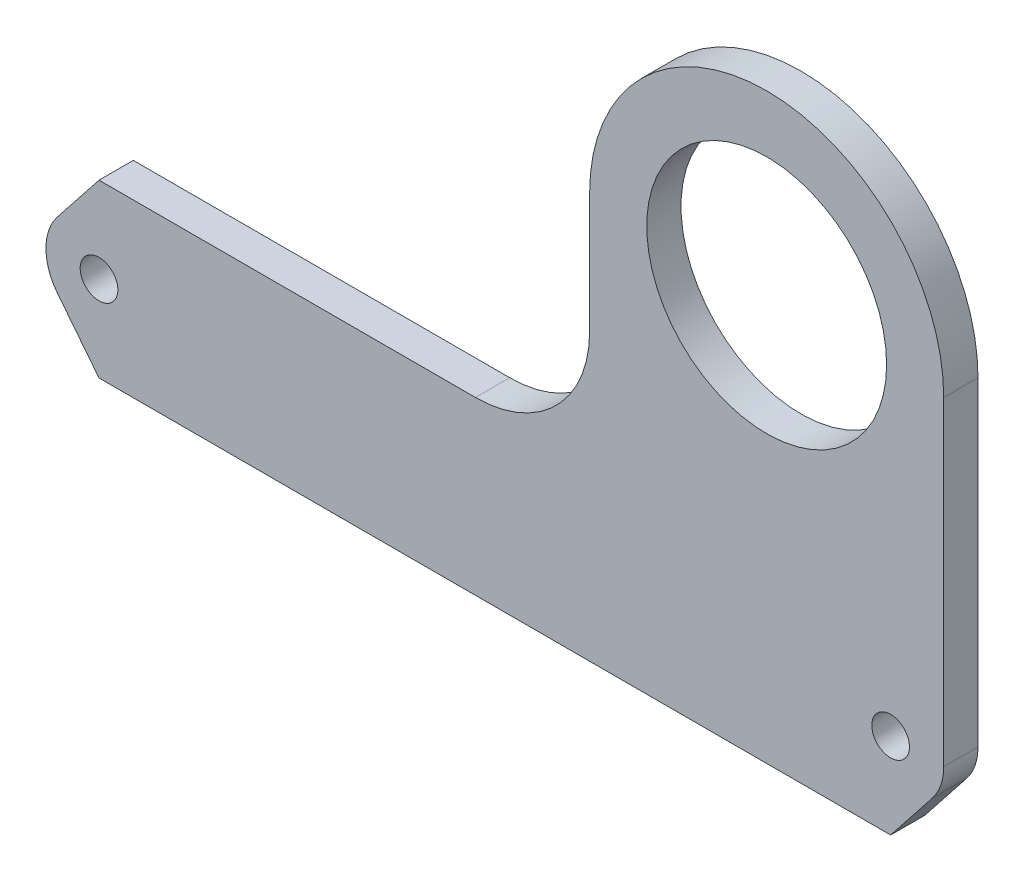
ISO-10303-21;
HEADER;
FILE_DESCRIPTION(('STEP AP214'),'2;1');
FILE_NAME('part.step','',(''),(''),'','','');
FILE_SCHEMA(('AUTOMOTIVE_DESIGN { 1 0 10303 214 1 1 1 1 }'));
ENDSEC;
DATA;
#1=APPLICATION_CONTEXT('core data for automotive mechanical design processes');
#2=APPLICATION_PROTOCOL_DEFINITION('international standard','automotive_design',2000,#1);
#3=PRODUCT_CONTEXT('',#1,'mechanical');
#4=PRODUCT('Part','Part','',(#3));
#5=PRODUCT_RELATED_PRODUCT_CATEGORY('part','',(#4));
#6=PRODUCT_DEFINITION_FORMATION('','',#4);
#7=PRODUCT_DEFINITION_CONTEXT('part definition',#1,'design');
#8=PRODUCT_DEFINITION('design','',#6,#7);
#9=PRODUCT_DEFINITION_SHAPE('','',#8);
#10=(LENGTH_UNIT() NAMED_UNIT(*) SI_UNIT(.MILLI.,.METRE.));
#11=(NAMED_UNIT(*) PLANE_ANGLE_UNIT() SI_UNIT($,.RADIAN.));
#12=(NAMED_UNIT(*) SI_UNIT($,.STERADIAN.) SOLID_ANGLE_UNIT());
#13=UNCERTAINTY_MEASURE_WITH_UNIT(LENGTH_MEASURE(1.E-05),#10,'distance_accuracy_value','');
#14=(GEOMETRIC_REPRESENTATION_CONTEXT(3) GLOBAL_UNCERTAINTY_ASSIGNED_CONTEXT((#13)) GLOBAL_UNIT_ASSIGNED_CONTEXT((#10,
#11,#12)) REPRESENTATION_CONTEXT('',''));
#15=CARTESIAN_POINT('',(0.,0.,0.));
#16=DIRECTION('',(0.,0.,1.));
#17=DIRECTION('',(1.,0.,0.));
#18=AXIS2_PLACEMENT_3D('',#15,#16,#17);
#19=CARTESIAN_POINT('',(0.,0.,3.));
#20=DIRECTION('',(0.,0.,1.));
#21=DIRECTION('',(1.,0.,0.));
#22=AXIS2_PLACEMENT_3D('',#19,#20,#21);
#23=PLANE('',#22);
#24=CARTESIAN_POINT('',(69.3,0.,3.));
#25=DIRECTION('',(0.,0.,1.));
#26=DIRECTION('',(1.,0.,0.));
#27=AXIS2_PLACEMENT_3D('',#24,#25,#26);
#28=CIRCLE('',#27,1.65);
#29=CARTESIAN_POINT('',(70.95,0.,3.));
#30=VERTEX_POINT('',#29);
#31=EDGE_CURVE('E313',#30,#30,#28,.T.);
#32=ORIENTED_EDGE('',*,*,#31,.F.);
#33=EDGE_LOOP('',(#32));
#34=FACE_BOUND('',#33,.T.);
#35=DIRECTION('',(-0.62,-0.784601809837322,0.));
#36=VECTOR('',#35,1.);
#37=CARTESIAN_POINT('',(0.,7.5,3.));
#38=LINE('',#37,#36);
#39=CARTESIAN_POINT('',(0.,7.5,3.));
#40=VERTEX_POINT('',#39);
#41=CARTESIAN_POINT('',(-3.64839841574354,2.883,3.));
#42=VERTEX_POINT('',#41);
#43=EDGE_CURVE('E194',#40,#42,#38,.T.);
#44=ORIENTED_EDGE('',*,*,#43,.T.);
#45=CARTESIAN_POINT('',(0.,0.,3.));
#46=DIRECTION('',(0.,0.,1.));
#47=DIRECTION('',(1.,0.,0.));
#48=AXIS2_PLACEMENT_3D('',#45,#46,#47);
#49=CIRCLE('',#48,4.65);
#50=CARTESIAN_POINT('',(-3.64839841574354,-2.883,3.));
#51=VERTEX_POINT('',#50);
#52=EDGE_CURVE('E112',#42,#51,#49,.T.);
#53=ORIENTED_EDGE('',*,*,#52,.T.);
#54=DIRECTION('',(0.62,-0.784601809837321,0.));
#55=VECTOR('',#54,1.);
#56=CARTESIAN_POINT('',(0.,-7.5,3.));
#57=LINE('',#56,#55);
#58=CARTESIAN_POINT('',(0.,-7.5,3.));
#59=VERTEX_POINT('',#58);
#60=EDGE_CURVE('E227',#51,#59,#57,.T.);
#61=ORIENTED_EDGE('',*,*,#60,.T.);
#62=DIRECTION('',(1.,0.,0.));
#63=VECTOR('',#62,1.);
#64=CARTESIAN_POINT('',(0.,-7.5,3.));
#65=LINE('',#64,#63);
#66=CARTESIAN_POINT('',(69.3,-7.5,3.));
#67=VERTEX_POINT('',#66);
#68=EDGE_CURVE('E247',#59,#67,#65,.T.);
#69=ORIENTED_EDGE('',*,*,#68,.T.);
#70=DIRECTION('',(0.620000000000001,0.784601809837321,0.));
#71=VECTOR('',#70,1.);
#72=CARTESIAN_POINT('',(69.3,-7.5,3.));
#73=LINE('',#72,#71);
#74=CARTESIAN_POINT('',(72.9483984157436,-2.883,3.));
#75=VERTEX_POINT('',#74);
#76=EDGE_CURVE('E243',#67,#75,#73,.T.);
#77=ORIENTED_EDGE('',*,*,#76,.T.);
#78=CARTESIAN_POINT('',(69.3,0.,3.));
#79=DIRECTION('',(0.,0.,1.));
#80=DIRECTION('',(1.,0.,0.));
#81=AXIS2_PLACEMENT_3D('',#78,#79,#80);
#82=CIRCLE('',#81,4.65);
#83=CARTESIAN_POINT('',(73.95,0.,3.));
#84=VERTEX_POINT('',#83);
#85=EDGE_CURVE('E246',#75,#84,#82,.T.);
#86=ORIENTED_EDGE('',*,*,#85,.T.);
#87=DIRECTION('',(0.,1.,0.));
#88=VECTOR('',#87,1.);
#89=CARTESIAN_POINT('',(73.95,28.,3.));
#90=LINE('',#89,#88);
#91=CARTESIAN_POINT('',(73.95,28.,3.));
#92=VERTEX_POINT('',#91);
#93=EDGE_CURVE('E251',#84,#92,#90,.T.);
#94=ORIENTED_EDGE('',*,*,#93,.T.);
#95=CARTESIAN_POINT('',(58.45,28.,3.));
#96=DIRECTION('',(0.,0.,1.));
#97=DIRECTION('',(1.,0.,0.));
#98=AXIS2_PLACEMENT_3D('',#95,#96,#97);
#99=CIRCLE('',#98,15.5);
#100=CARTESIAN_POINT('',(42.95,28.,3.));
#101=VERTEX_POINT('',#100);
#102=EDGE_CURVE('E140',#92,#101,#99,.T.);
#103=ORIENTED_EDGE('',*,*,#102,.T.);
#104=DIRECTION('',(0.,-1.,0.));
#105=VECTOR('',#104,1.);
#106=CARTESIAN_POINT('',(42.95,17.5000000000001,3.));
#107=LINE('',#106,#105);
#108=CARTESIAN_POINT('',(42.95,17.5000000000001,3.));
#109=VERTEX_POINT('',#108);
#110=EDGE_CURVE('E134',#101,#109,#107,.T.);
#111=ORIENTED_EDGE('',*,*,#110,.T.);
#112=CARTESIAN_POINT('',(32.95,17.5,3.));
#113=DIRECTION('',(0.,0.,-1.));
#114=DIRECTION('',(-1.,0.,0.));
#115=AXIS2_PLACEMENT_3D('',#112,#113,#114);
#116=CIRCLE('',#115,10.);
#117=CARTESIAN_POINT('',(32.9499999999999,7.5,3.));
#118=VERTEX_POINT('',#117);
#119=EDGE_CURVE('E138',#109,#118,#116,.T.);
#120=ORIENTED_EDGE('',*,*,#119,.T.);
#121=DIRECTION('',(-1.,0.,0.));
#122=VECTOR('',#121,1.);
#123=CARTESIAN_POINT('',(0.,7.5,3.));
#124=LINE('',#123,#122);
#125=EDGE_CURVE('E60',#118,#40,#124,.T.);
#126=ORIENTED_EDGE('',*,*,#125,.T.);
#127=EDGE_LOOP('',(#44,#53,#61,#69,#77,#86,#94,#103,#111,#120,#126));
#128=FACE_BOUND('',#127,.T.);
#129=CARTESIAN_POINT('',(0.,0.,3.));
#130=DIRECTION('',(0.,0.,1.));
#131=DIRECTION('',(1.,0.,0.));
#132=AXIS2_PLACEMENT_3D('',#129,#130,#131);
#133=CIRCLE('',#132,1.65);
#134=CARTESIAN_POINT('',(1.65,0.,3.));
#135=VERTEX_POINT('',#134);
#136=EDGE_CURVE('E167',#135,#135,#133,.T.);
#137=ORIENTED_EDGE('',*,*,#136,.F.);
#138=EDGE_LOOP('',(#137));
#139=FACE_BOUND('',#138,.T.);
#140=CARTESIAN_POINT('',(58.45,28.,3.));
#141=DIRECTION('',(0.,0.,1.));
#142=DIRECTION('',(1.,0.,0.));
#143=AXIS2_PLACEMENT_3D('',#140,#141,#142);
#144=CIRCLE('',#143,10.5);
#145=CARTESIAN_POINT('',(68.95,28.,3.));
#146=VERTEX_POINT('',#145);
#147=EDGE_CURVE('E302',#146,#146,#144,.T.);
#148=ORIENTED_EDGE('',*,*,#147,.F.);
#149=EDGE_LOOP('',(#148));
#150=FACE_BOUND('',#149,.T.);
#151=ADVANCED_FACE('F42',(#34,#128,#139,#150),#23,.T.);
#152=CARTESIAN_POINT('',(0.,0.,0.));
#153=DIRECTION('',(0.,0.,1.));
#154=DIRECTION('',(1.,0.,0.));
#155=AXIS2_PLACEMENT_3D('',#152,#153,#154);
#156=PLANE('',#155);
#157=DIRECTION('',(-0.62,-0.784601809837322,0.));
#158=VECTOR('',#157,1.);
#159=CARTESIAN_POINT('',(0.,7.5,0.));
#160=LINE('',#159,#158);
#161=CARTESIAN_POINT('',(0.,7.5,0.));
#162=VERTEX_POINT('',#161);
#163=CARTESIAN_POINT('',(-3.64839841574354,2.883,0.));
#164=VERTEX_POINT('',#163);
#165=EDGE_CURVE('E162',#162,#164,#160,.T.);
#166=ORIENTED_EDGE('',*,*,#165,.F.);
#167=DIRECTION('',(-1.,0.,0.));
#168=VECTOR('',#167,1.);
#169=CARTESIAN_POINT('',(0.,7.5,0.));
#170=LINE('',#169,#168);
#171=CARTESIAN_POINT('',(32.9499999999999,7.5,0.));
#172=VERTEX_POINT('',#171);
#173=EDGE_CURVE('E104',#172,#162,#170,.T.);
#174=ORIENTED_EDGE('',*,*,#173,.F.);
#175=CARTESIAN_POINT('',(32.95,17.5,0.));
#176=DIRECTION('',(0.,0.,-1.));
#177=DIRECTION('',(-1.,0.,0.));
#178=AXIS2_PLACEMENT_3D('',#175,#176,#177);
#179=CIRCLE('',#178,10.);
#180=CARTESIAN_POINT('',(42.95,17.5000000000001,0.));
#181=VERTEX_POINT('',#180);
#182=EDGE_CURVE('E98',#181,#172,#179,.T.);
#183=ORIENTED_EDGE('',*,*,#182,.F.);
#184=DIRECTION('',(0.,-1.,0.));
#185=VECTOR('',#184,1.);
#186=CARTESIAN_POINT('',(42.95,17.5000000000001,0.));
#187=LINE('',#186,#185);
#188=CARTESIAN_POINT('',(42.95,28.,0.));
#189=VERTEX_POINT('',#188);
#190=EDGE_CURVE('E149',#189,#181,#187,.T.);
#191=ORIENTED_EDGE('',*,*,#190,.F.);
#192=CARTESIAN_POINT('',(58.45,28.,0.));
#193=DIRECTION('',(0.,0.,1.));
#194=DIRECTION('',(1.,0.,0.));
#195=AXIS2_PLACEMENT_3D('',#192,#193,#194);
#196=CIRCLE('',#195,15.5);
#197=CARTESIAN_POINT('',(73.95,28.,0.));
#198=VERTEX_POINT('',#197);
#199=EDGE_CURVE('E185',#198,#189,#196,.T.);
#200=ORIENTED_EDGE('',*,*,#199,.F.);
#201=DIRECTION('',(0.,1.,0.));
#202=VECTOR('',#201,1.);
#203=CARTESIAN_POINT('',(73.95,28.,0.));
#204=LINE('',#203,#202);
#205=CARTESIAN_POINT('',(73.95,0.,0.));
#206=VERTEX_POINT('',#205);
#207=EDGE_CURVE('E182',#206,#198,#204,.T.);
#208=ORIENTED_EDGE('',*,*,#207,.F.);
#209=CARTESIAN_POINT('',(69.3,0.,0.));
#210=DIRECTION('',(0.,0.,1.));
#211=DIRECTION('',(1.,0.,0.));
#212=AXIS2_PLACEMENT_3D('',#209,#210,#211);
#213=CIRCLE('',#212,4.65);
#214=CARTESIAN_POINT('',(72.9483984157436,-2.883,0.));
#215=VERTEX_POINT('',#214);
#216=EDGE_CURVE('E179',#215,#206,#213,.T.);
#217=ORIENTED_EDGE('',*,*,#216,.F.);
#218=DIRECTION('',(0.620000000000001,0.784601809837321,0.));
#219=VECTOR('',#218,1.);
#220=CARTESIAN_POINT('',(69.3,-7.5,0.));
#221=LINE('',#220,#219);
#222=CARTESIAN_POINT('',(69.3,-7.5,0.));
#223=VERTEX_POINT('',#222);
#224=EDGE_CURVE('E176',#223,#215,#221,.T.);
#225=ORIENTED_EDGE('',*,*,#224,.F.);
#226=DIRECTION('',(1.,0.,0.));
#227=VECTOR('',#226,1.);
#228=CARTESIAN_POINT('',(0.,-7.5,0.));
#229=LINE('',#228,#227);
#230=CARTESIAN_POINT('',(0.,-7.5,0.));
#231=VERTEX_POINT('',#230);
#232=EDGE_CURVE('E173',#231,#223,#229,.T.);
#233=ORIENTED_EDGE('',*,*,#232,.F.);
#234=DIRECTION('',(0.62,-0.784601809837321,0.));
#235=VECTOR('',#234,1.);
#236=CARTESIAN_POINT('',(0.,-7.5,0.));
#237=LINE('',#236,#235);
#238=CARTESIAN_POINT('',(-3.64839841574354,-2.883,0.));
#239=VERTEX_POINT('',#238);
#240=EDGE_CURVE('E170',#239,#231,#237,.T.);
#241=ORIENTED_EDGE('',*,*,#240,.F.);
#242=CARTESIAN_POINT('',(0.,0.,0.));
#243=DIRECTION('',(0.,0.,1.));
#244=DIRECTION('',(1.,0.,0.));
#245=AXIS2_PLACEMENT_3D('',#242,#243,#244);
#246=CIRCLE('',#245,4.65);
#247=EDGE_CURVE('E166',#164,#239,#246,.T.);
#248=ORIENTED_EDGE('',*,*,#247,.F.);
#249=EDGE_LOOP('',(#166,#174,#183,#191,#200,#208,#217,#225,#233,#241,#248));
#250=FACE_BOUND('',#249,.T.);
#251=CARTESIAN_POINT('',(0.,0.,0.));
#252=DIRECTION('',(0.,0.,1.));
#253=DIRECTION('',(1.,0.,0.));
#254=AXIS2_PLACEMENT_3D('',#251,#252,#253);
#255=CIRCLE('',#254,1.65);
#256=CARTESIAN_POINT('',(1.65,0.,0.));
#257=VERTEX_POINT('',#256);
#258=EDGE_CURVE('E317',#257,#257,#255,.T.);
#259=ORIENTED_EDGE('',*,*,#258,.T.);
#260=EDGE_LOOP('',(#259));
#261=FACE_BOUND('',#260,.T.);
#262=CARTESIAN_POINT('',(69.3,0.,0.));
#263=DIRECTION('',(0.,0.,1.));
#264=DIRECTION('',(1.,0.,0.));
#265=AXIS2_PLACEMENT_3D('',#262,#263,#264);
#266=CIRCLE('',#265,1.65);
#267=CARTESIAN_POINT('',(70.95,0.,0.));
#268=VERTEX_POINT('',#267);
#269=EDGE_CURVE('E310',#268,#268,#266,.T.);
#270=ORIENTED_EDGE('',*,*,#269,.T.);
#271=EDGE_LOOP('',(#270));
#272=FACE_BOUND('',#271,.T.);
#273=CARTESIAN_POINT('',(58.45,28.,0.));
#274=DIRECTION('',(0.,0.,1.));
#275=DIRECTION('',(1.,0.,0.));
#276=AXIS2_PLACEMENT_3D('',#273,#274,#275);
#277=CIRCLE('',#276,10.5);
#278=CARTESIAN_POINT('',(68.95,28.,0.));
#279=VERTEX_POINT('',#278);
#280=EDGE_CURVE('E305',#279,#279,#277,.T.);
#281=ORIENTED_EDGE('',*,*,#280,.T.);
#282=EDGE_LOOP('',(#281));
#283=FACE_BOUND('',#282,.T.);
#284=ADVANCED_FACE('F231',(#250,#261,#272,#283),#156,.F.);
#285=CARTESIAN_POINT('',(0.,7.5,3.));
#286=DIRECTION('',(0.784601809837322,-0.619999999999999,0.));
#287=DIRECTION('',(0.62,0.784601809837322,0.));
#288=AXIS2_PLACEMENT_3D('',#285,#286,#287);
#289=PLANE('',#288);
#290=ORIENTED_EDGE('',*,*,#165,.T.);
#291=DIRECTION('',(0.,0.,-1.));
#292=VECTOR('',#291,1.);
#293=CARTESIAN_POINT('',(-3.64839841574354,2.883,3.));
#294=LINE('',#293,#292);
#295=EDGE_CURVE('E11',#42,#164,#294,.T.);
#296=ORIENTED_EDGE('',*,*,#295,.F.);
#297=ORIENTED_EDGE('',*,*,#43,.F.);
#298=DIRECTION('',(0.,0.,-1.));
#299=VECTOR('',#298,1.);
#300=CARTESIAN_POINT('',(0.,7.5,3.));
#301=LINE('',#300,#299);
#302=EDGE_CURVE('E158',#40,#162,#301,.T.);
#303=ORIENTED_EDGE('',*,*,#302,.T.);
#304=EDGE_LOOP('',(#290,#296,#297,#303));
#305=FACE_BOUND('',#304,.T.);
#306=ADVANCED_FACE('F44',(#305),#289,.F.);
#307=CARTESIAN_POINT('',(0.,0.,3.));
#308=DIRECTION('',(0.,0.,-1.));
#309=DIRECTION('',(-1.,0.,0.));
#310=AXIS2_PLACEMENT_3D('',#307,#308,#309);
#311=CYLINDRICAL_SURFACE('',#310,4.65);
#312=ORIENTED_EDGE('',*,*,#247,.T.);
#313=DIRECTION('',(0.,0.,-1.));
#314=VECTOR('',#313,1.);
#315=CARTESIAN_POINT('',(-3.64839841574354,-2.883,3.));
#316=LINE('',#315,#314);
#317=EDGE_CURVE('E52',#51,#239,#316,.T.);
#318=ORIENTED_EDGE('',*,*,#317,.F.);
#319=ORIENTED_EDGE('',*,*,#52,.F.);
#320=ORIENTED_EDGE('',*,*,#295,.T.);
#321=EDGE_LOOP('',(#312,#318,#319,#320));
#322=FACE_BOUND('',#321,.T.);
#323=ADVANCED_FACE('F424',(#322),#311,.T.);
#324=CARTESIAN_POINT('',(0.,-7.5,3.));
#325=DIRECTION('',(0.784601809837321,0.62,0.));
#326=DIRECTION('',(-0.62,0.784601809837321,0.));
#327=AXIS2_PLACEMENT_3D('',#324,#325,#326);
#328=PLANE('',#327);
#329=ORIENTED_EDGE('',*,*,#240,.T.);
#330=DIRECTION('',(0.,0.,-1.));
#331=VECTOR('',#330,1.);
#332=CARTESIAN_POINT('',(0.,-7.5,3.));
#333=LINE('',#332,#331);
#334=EDGE_CURVE('E217',#59,#231,#333,.T.);
#335=ORIENTED_EDGE('',*,*,#334,.F.);
#336=ORIENTED_EDGE('',*,*,#60,.F.);
#337=ORIENTED_EDGE('',*,*,#317,.T.);
#338=EDGE_LOOP('',(#329,#335,#336,#337));
#339=FACE_BOUND('',#338,.T.);
#340=ADVANCED_FACE('F225',(#339),#328,.F.);
#341=CARTESIAN_POINT('',(0.,-7.5,3.));
#342=DIRECTION('',(0.,1.,0.));
#343=DIRECTION('',(0.,0.,1.));
#344=AXIS2_PLACEMENT_3D('',#341,#342,#343);
#345=PLANE('',#344);
#346=ORIENTED_EDGE('',*,*,#232,.T.);
#347=DIRECTION('',(0.,0.,-1.));
#348=VECTOR('',#347,1.);
#349=CARTESIAN_POINT('',(69.3,-7.5,3.));
#350=LINE('',#349,#348);
#351=EDGE_CURVE('E213',#67,#223,#350,.T.);
#352=ORIENTED_EDGE('',*,*,#351,.F.);
#353=ORIENTED_EDGE('',*,*,#68,.F.);
#354=ORIENTED_EDGE('',*,*,#334,.T.);
#355=EDGE_LOOP('',(#346,#352,#353,#354));
#356=FACE_BOUND('',#355,.T.);
#357=ADVANCED_FACE('F237',(#356),#345,.F.);
#358=CARTESIAN_POINT('',(69.3,-7.5,3.));
#359=DIRECTION('',(-0.784601809837321,0.620000000000001,0.));
#360=DIRECTION('',(-0.620000000000001,-0.784601809837321,0.));
#361=AXIS2_PLACEMENT_3D('',#358,#359,#360);
#362=PLANE('',#361);
#363=ORIENTED_EDGE('',*,*,#224,.T.);
#364=DIRECTION('',(0.,0.,-1.));
#365=VECTOR('',#364,1.);
#366=CARTESIAN_POINT('',(72.9483984157436,-2.883,3.));
#367=LINE('',#366,#365);
#368=EDGE_CURVE('E209',#75,#215,#367,.T.);
#369=ORIENTED_EDGE('',*,*,#368,.F.);
#370=ORIENTED_EDGE('',*,*,#76,.F.);
#371=ORIENTED_EDGE('',*,*,#351,.T.);
#372=EDGE_LOOP('',(#363,#369,#370,#371));
#373=FACE_BOUND('',#372,.T.);
#374=ADVANCED_FACE('F241',(#373),#362,.F.);
#375=CARTESIAN_POINT('',(69.3,0.,3.));
#376=DIRECTION('',(0.,0.,-1.));
#377=DIRECTION('',(-1.,0.,0.));
#378=AXIS2_PLACEMENT_3D('',#375,#376,#377);
#379=CYLINDRICAL_SURFACE('',#378,4.65);
#380=ORIENTED_EDGE('',*,*,#216,.T.);
#381=DIRECTION('',(0.,0.,-1.));
#382=VECTOR('',#381,1.);
#383=CARTESIAN_POINT('',(73.95,0.,3.));
#384=LINE('',#383,#382);
#385=EDGE_CURVE('E205',#84,#206,#384,.T.);
#386=ORIENTED_EDGE('',*,*,#385,.F.);
#387=ORIENTED_EDGE('',*,*,#85,.F.);
#388=ORIENTED_EDGE('',*,*,#368,.T.);
#389=EDGE_LOOP('',(#380,#386,#387,#388));
#390=FACE_BOUND('',#389,.T.);
#391=ADVANCED_FACE('F386',(#390),#379,.T.);
#392=CARTESIAN_POINT('',(73.95,28.,3.));
#393=DIRECTION('',(-1.,0.,0.));
#394=DIRECTION('',(0.,-1.,0.));
#395=AXIS2_PLACEMENT_3D('',#392,#393,#394);
#396=PLANE('',#395);
#397=ORIENTED_EDGE('',*,*,#207,.T.);
#398=DIRECTION('',(0.,0.,-1.));
#399=VECTOR('',#398,1.);
#400=CARTESIAN_POINT('',(73.95,28.,3.));
#401=LINE('',#400,#399);
#402=EDGE_CURVE('E201',#92,#198,#401,.T.);
#403=ORIENTED_EDGE('',*,*,#402,.F.);
#404=ORIENTED_EDGE('',*,*,#93,.F.);
#405=ORIENTED_EDGE('',*,*,#385,.T.);
#406=EDGE_LOOP('',(#397,#403,#404,#405));
#407=FACE_BOUND('',#406,.T.);
#408=ADVANCED_FACE('F262',(#407),#396,.F.);
#409=CARTESIAN_POINT('',(58.45,28.,3.));
#410=DIRECTION('',(0.,0.,-1.));
#411=DIRECTION('',(-1.,0.,0.));
#412=AXIS2_PLACEMENT_3D('',#409,#410,#411);
#413=CYLINDRICAL_SURFACE('',#412,15.5);
#414=ORIENTED_EDGE('',*,*,#199,.T.);
#415=DIRECTION('',(0.,0.,-1.));
#416=VECTOR('',#415,1.);
#417=CARTESIAN_POINT('',(42.95,28.,3.));
#418=LINE('',#417,#416);
#419=EDGE_CURVE('E151',#101,#189,#418,.T.);
#420=ORIENTED_EDGE('',*,*,#419,.F.);
#421=ORIENTED_EDGE('',*,*,#102,.F.);
#422=ORIENTED_EDGE('',*,*,#402,.T.);
#423=EDGE_LOOP('',(#414,#420,#421,#422));
#424=FACE_BOUND('',#423,.T.);
#425=ADVANCED_FACE('F266',(#424),#413,.T.);
#426=CARTESIAN_POINT('',(42.95,17.5000000000001,3.));
#427=DIRECTION('',(1.,0.,0.));
#428=DIRECTION('',(0.,0.,-1.));
#429=AXIS2_PLACEMENT_3D('',#426,#427,#428);
#430=PLANE('',#429);
#431=ORIENTED_EDGE('',*,*,#190,.T.);
#432=DIRECTION('',(0.,0.,-1.));
#433=VECTOR('',#432,1.);
#434=CARTESIAN_POINT('',(42.95,17.5000000000001,3.));
#435=LINE('',#434,#433);
#436=EDGE_CURVE('E146',#109,#181,#435,.T.);
#437=ORIENTED_EDGE('',*,*,#436,.F.);
#438=ORIENTED_EDGE('',*,*,#110,.F.);
#439=ORIENTED_EDGE('',*,*,#419,.T.);
#440=EDGE_LOOP('',(#431,#437,#438,#439));
#441=FACE_BOUND('',#440,.T.);
#442=ADVANCED_FACE('F147',(#441),#430,.F.);
#443=CARTESIAN_POINT('',(32.95,17.5,3.));
#444=DIRECTION('',(0.,0.,-1.));
#445=DIRECTION('',(-1.,0.,0.));
#446=AXIS2_PLACEMENT_3D('',#443,#444,#445);
#447=CYLINDRICAL_SURFACE('',#446,10.);
#448=ORIENTED_EDGE('',*,*,#182,.T.);
#449=DIRECTION('',(0.,0.,-1.));
#450=VECTOR('',#449,1.);
#451=CARTESIAN_POINT('',(32.9499999999999,7.5,3.));
#452=LINE('',#451,#450);
#453=EDGE_CURVE('E152',#118,#172,#452,.T.);
#454=ORIENTED_EDGE('',*,*,#453,.F.);
#455=ORIENTED_EDGE('',*,*,#119,.F.);
#456=ORIENTED_EDGE('',*,*,#436,.T.);
#457=EDGE_LOOP('',(#448,#454,#455,#456));
#458=FACE_BOUND('',#457,.T.);
#459=ADVANCED_FACE('F154',(#458),#447,.F.);
#460=CARTESIAN_POINT('',(0.,7.5,3.));
#461=DIRECTION('',(0.,-1.,0.));
#462=DIRECTION('',(0.,0.,-1.));
#463=AXIS2_PLACEMENT_3D('',#460,#461,#462);
#464=PLANE('',#463);
#465=ORIENTED_EDGE('',*,*,#173,.T.);
#466=ORIENTED_EDGE('',*,*,#302,.F.);
#467=ORIENTED_EDGE('',*,*,#125,.F.);
#468=ORIENTED_EDGE('',*,*,#453,.T.);
#469=EDGE_LOOP('',(#465,#466,#467,#468));
#470=FACE_BOUND('',#469,.T.);
#471=ADVANCED_FACE('F270',(#470),#464,.F.);
#472=CARTESIAN_POINT('',(0.,0.,3.));
#473=DIRECTION('',(0.,0.,-1.));
#474=DIRECTION('',(-1.,0.,0.));
#475=AXIS2_PLACEMENT_3D('',#472,#473,#474);
#476=CYLINDRICAL_SURFACE('',#475,1.65);
#477=ORIENTED_EDGE('',*,*,#136,.T.);
#478=EDGE_LOOP('',(#477));
#479=FACE_BOUND('',#478,.T.);
#480=ORIENTED_EDGE('',*,*,#258,.F.);
#481=EDGE_LOOP('',(#480));
#482=FACE_BOUND('',#481,.T.);
#483=ADVANCED_FACE('F272',(#479,#482),#476,.F.);
#484=CARTESIAN_POINT('',(69.3,0.,3.));
#485=DIRECTION('',(0.,0.,-1.));
#486=DIRECTION('',(-1.,0.,0.));
#487=AXIS2_PLACEMENT_3D('',#484,#485,#486);
#488=CYLINDRICAL_SURFACE('',#487,1.65);
#489=ORIENTED_EDGE('',*,*,#31,.T.);
#490=EDGE_LOOP('',(#489));
#491=FACE_BOUND('',#490,.T.);
#492=ORIENTED_EDGE('',*,*,#269,.F.);
#493=EDGE_LOOP('',(#492));
#494=FACE_BOUND('',#493,.T.);
#495=ADVANCED_FACE('F278',(#491,#494),#488,.F.);
#496=CARTESIAN_POINT('',(58.45,28.,3.));
#497=DIRECTION('',(0.,0.,-1.));
#498=DIRECTION('',(-1.,0.,0.));
#499=AXIS2_PLACEMENT_3D('',#496,#497,#498);
#500=CYLINDRICAL_SURFACE('',#499,10.5);
#501=ORIENTED_EDGE('',*,*,#147,.T.);
#502=EDGE_LOOP('',(#501));
#503=FACE_BOUND('',#502,.T.);
#504=ORIENTED_EDGE('',*,*,#280,.F.);
#505=EDGE_LOOP('',(#504));
#506=FACE_BOUND('',#505,.T.);
#507=ADVANCED_FACE('F293',(#503,#506),#500,.F.);
#508=CLOSED_SHELL('',(#151,#284,#306,#323,#340,#357,#374,#391,#408,#425,#442,#459,#471,#483,
#495,#507));
#509=MANIFOLD_SOLID_BREP('B2',#508);
#510=ADVANCED_BREP_SHAPE_REPRESENTATION('',(#18,#509),#14);
#511=SHAPE_DEFINITION_REPRESENTATION(#9,#510);
ENDSEC;
END-ISO-10303-21;
